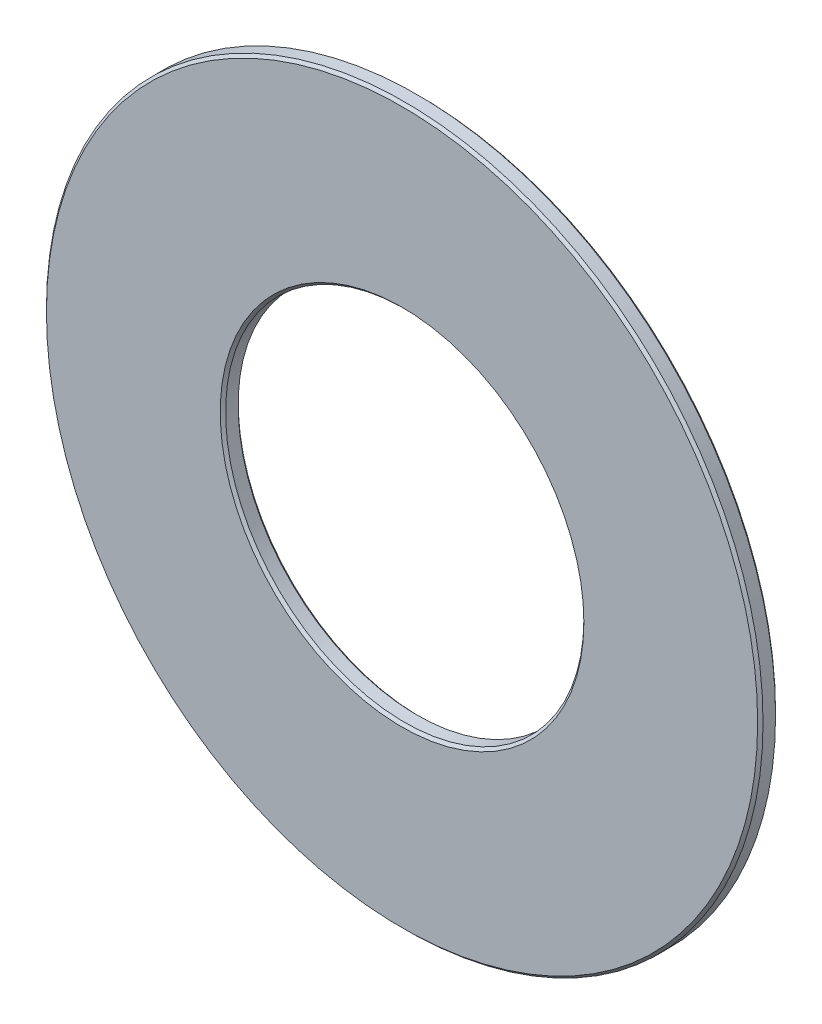
ISO-10303-21;
HEADER;
FILE_DESCRIPTION(('STEP AP214'),'2;1');
FILE_NAME('part.step','',(''),(''),'','','');
FILE_SCHEMA(('AUTOMOTIVE_DESIGN { 1 0 10303 214 1 1 1 1 }'));
ENDSEC;
DATA;
#1=APPLICATION_CONTEXT('core data for automotive mechanical design processes');
#2=APPLICATION_PROTOCOL_DEFINITION('international standard','automotive_design',2000,#1);
#3=PRODUCT_CONTEXT('',#1,'mechanical');
#4=PRODUCT('Part','Part','',(#3));
#5=PRODUCT_RELATED_PRODUCT_CATEGORY('part','',(#4));
#6=PRODUCT_DEFINITION_FORMATION('','',#4);
#7=PRODUCT_DEFINITION_CONTEXT('part definition',#1,'design');
#8=PRODUCT_DEFINITION('design','',#6,#7);
#9=PRODUCT_DEFINITION_SHAPE('','',#8);
#10=(LENGTH_UNIT() NAMED_UNIT(*) SI_UNIT(.MILLI.,.METRE.));
#11=(NAMED_UNIT(*) PLANE_ANGLE_UNIT() SI_UNIT($,.RADIAN.));
#12=(NAMED_UNIT(*) SI_UNIT($,.STERADIAN.) SOLID_ANGLE_UNIT());
#13=UNCERTAINTY_MEASURE_WITH_UNIT(LENGTH_MEASURE(1.E-05),#10,'distance_accuracy_value','');
#14=(GEOMETRIC_REPRESENTATION_CONTEXT(3) GLOBAL_UNCERTAINTY_ASSIGNED_CONTEXT((#13)) GLOBAL_UNIT_ASSIGNED_CONTEXT((#10,
#11,#12)) REPRESENTATION_CONTEXT('',''));
#15=CARTESIAN_POINT('',(0.,0.,0.));
#16=DIRECTION('',(0.,0.,1.));
#17=DIRECTION('',(1.,0.,0.));
#18=AXIS2_PLACEMENT_3D('',#15,#16,#17);
#19=CARTESIAN_POINT('',(0.,0.,0.1));
#20=DIRECTION('',(0.,0.,1.));
#21=DIRECTION('',(1.,0.,0.));
#22=AXIS2_PLACEMENT_3D('',#19,#20,#21);
#23=PLANE('',#22);
#24=CARTESIAN_POINT('',(0.,0.,0.1));
#25=DIRECTION('',(0.,0.,1.));
#26=DIRECTION('',(1.,0.,0.));
#27=AXIS2_PLACEMENT_3D('',#24,#25,#26);
#28=CIRCLE('',#27,2.03);
#29=CARTESIAN_POINT('',(2.03,0.,0.1));
#30=VERTEX_POINT('',#29);
#31=EDGE_CURVE('E56',#30,#30,#28,.F.);
#32=ORIENTED_EDGE('',*,*,#31,.T.);
#33=EDGE_LOOP('',(#32));
#34=FACE_BOUND('',#33,.T.);
#35=CARTESIAN_POINT('',(0.,0.,0.1));
#36=DIRECTION('',(0.,0.,1.));
#37=DIRECTION('',(1.,0.,0.));
#38=AXIS2_PLACEMENT_3D('',#35,#36,#37);
#39=CIRCLE('',#38,3.97);
#40=CARTESIAN_POINT('',(-3.97,0.,0.1));
#41=VERTEX_POINT('',#40);
#42=EDGE_CURVE('E59',#41,#41,#39,.T.);
#43=ORIENTED_EDGE('',*,*,#42,.T.);
#44=EDGE_LOOP('',(#43));
#45=FACE_BOUND('',#44,.T.);
#46=ADVANCED_FACE('F35',(#34,#45),#23,.T.);
#47=CARTESIAN_POINT('',(0.,0.,-0.1));
#48=DIRECTION('',(0.,0.,1.));
#49=DIRECTION('',(1.,0.,0.));
#50=AXIS2_PLACEMENT_3D('',#47,#48,#49);
#51=PLANE('',#50);
#52=CARTESIAN_POINT('',(0.,0.,-0.1));
#53=DIRECTION('',(0.,0.,1.));
#54=DIRECTION('',(1.,0.,0.));
#55=AXIS2_PLACEMENT_3D('',#52,#53,#54);
#56=CIRCLE('',#55,2.03);
#57=CARTESIAN_POINT('',(2.03,0.,-0.1));
#58=VERTEX_POINT('',#57);
#59=EDGE_CURVE('E47',#58,#58,#56,.T.);
#60=ORIENTED_EDGE('',*,*,#59,.T.);
#61=EDGE_LOOP('',(#60));
#62=FACE_BOUND('',#61,.T.);
#63=CARTESIAN_POINT('',(0.,0.,-0.1));
#64=DIRECTION('',(0.,0.,1.));
#65=DIRECTION('',(1.,0.,0.));
#66=AXIS2_PLACEMENT_3D('',#63,#64,#65);
#67=CIRCLE('',#66,3.97);
#68=CARTESIAN_POINT('',(3.97,0.,-0.1));
#69=VERTEX_POINT('',#68);
#70=EDGE_CURVE('E51',#69,#69,#67,.F.);
#71=ORIENTED_EDGE('',*,*,#70,.T.);
#72=EDGE_LOOP('',(#71));
#73=FACE_BOUND('',#72,.T.);
#74=ADVANCED_FACE('F79',(#62,#73),#51,.F.);
#75=CARTESIAN_POINT('',(0.,0.,0.1));
#76=DIRECTION('',(0.,0.,-1.));
#77=DIRECTION('',(-1.,0.,0.));
#78=AXIS2_PLACEMENT_3D('',#75,#76,#77);
#79=CYLINDRICAL_SURFACE('',#78,4.);
#80=CARTESIAN_POINT('',(0.,0.,-0.0700000000000004));
#81=DIRECTION('',(0.,0.,1.));
#82=DIRECTION('',(1.,0.,0.));
#83=AXIS2_PLACEMENT_3D('',#80,#81,#82);
#84=CIRCLE('',#83,4.);
#85=CARTESIAN_POINT('',(4.,0.,-0.0700000000000004));
#86=VERTEX_POINT('',#85);
#87=EDGE_CURVE('E10',#86,#86,#84,.T.);
#88=ORIENTED_EDGE('',*,*,#87,.T.);
#89=EDGE_LOOP('',(#88));
#90=FACE_BOUND('',#89,.T.);
#91=CARTESIAN_POINT('',(0.,0.,0.0700000000000012));
#92=DIRECTION('',(0.,0.,1.));
#93=DIRECTION('',(1.,0.,0.));
#94=AXIS2_PLACEMENT_3D('',#91,#92,#93);
#95=CIRCLE('',#94,4.);
#96=CARTESIAN_POINT('',(-4.,0.,0.0700000000000012));
#97=VERTEX_POINT('',#96);
#98=EDGE_CURVE('E43',#97,#97,#95,.F.);
#99=ORIENTED_EDGE('',*,*,#98,.T.);
#100=EDGE_LOOP('',(#99));
#101=FACE_BOUND('',#100,.T.);
#102=ADVANCED_FACE('F82',(#90,#101),#79,.T.);
#103=CARTESIAN_POINT('',(0.,0.,0.1));
#104=DIRECTION('',(0.,0.,-1.));
#105=DIRECTION('',(-1.,0.,0.));
#106=AXIS2_PLACEMENT_3D('',#103,#104,#105);
#107=CYLINDRICAL_SURFACE('',#106,2.);
#108=CARTESIAN_POINT('',(0.,0.,0.0700000000000008));
#109=DIRECTION('',(0.,0.,1.));
#110=DIRECTION('',(1.,0.,0.));
#111=AXIS2_PLACEMENT_3D('',#108,#109,#110);
#112=CIRCLE('',#111,2.);
#113=CARTESIAN_POINT('',(2.,0.,0.0700000000000008));
#114=VERTEX_POINT('',#113);
#115=EDGE_CURVE('E62',#114,#114,#112,.T.);
#116=ORIENTED_EDGE('',*,*,#115,.T.);
#117=EDGE_LOOP('',(#116));
#118=FACE_BOUND('',#117,.T.);
#119=CARTESIAN_POINT('',(0.,0.,-0.070000000000003));
#120=DIRECTION('',(0.,0.,1.));
#121=DIRECTION('',(1.,0.,0.));
#122=AXIS2_PLACEMENT_3D('',#119,#120,#121);
#123=CIRCLE('',#122,2.);
#124=CARTESIAN_POINT('',(2.,0.,-0.070000000000003));
#125=VERTEX_POINT('',#124);
#126=EDGE_CURVE('E65',#125,#125,#123,.F.);
#127=ORIENTED_EDGE('',*,*,#126,.T.);
#128=EDGE_LOOP('',(#127));
#129=FACE_BOUND('',#128,.T.);
#130=ADVANCED_FACE('F69',(#118,#129),#107,.F.);
#131=CARTESIAN_POINT('',(0.,0.,0.0700000000000008));
#132=DIRECTION('',(0.,0.,1.));
#133=DIRECTION('',(1.,0.,0.));
#134=AXIS2_PLACEMENT_3D('',#131,#132,#133);
#135=CONICAL_SURFACE('',#134,2.,0.785398163397441);
#136=ORIENTED_EDGE('',*,*,#31,.F.);
#137=EDGE_LOOP('',(#136));
#138=FACE_BOUND('',#137,.T.);
#139=ORIENTED_EDGE('',*,*,#115,.F.);
#140=EDGE_LOOP('',(#139));
#141=FACE_BOUND('',#140,.T.);
#142=ADVANCED_FACE('F75',(#138,#141),#135,.F.);
#143=CARTESIAN_POINT('',(0.,0.,-0.1));
#144=DIRECTION('',(0.,0.,-1.));
#145=DIRECTION('',(-1.,0.,0.));
#146=AXIS2_PLACEMENT_3D('',#143,#144,#145);
#147=CONICAL_SURFACE('',#146,2.03,0.785398163397448);
#148=ORIENTED_EDGE('',*,*,#126,.F.);
#149=EDGE_LOOP('',(#148));
#150=FACE_BOUND('',#149,.T.);
#151=ORIENTED_EDGE('',*,*,#59,.F.);
#152=EDGE_LOOP('',(#151));
#153=FACE_BOUND('',#152,.T.);
#154=ADVANCED_FACE('F71',(#150,#153),#147,.F.);
#155=CARTESIAN_POINT('',(0.,0.,-0.0700000000000004));
#156=DIRECTION('',(0.,0.,1.));
#157=DIRECTION('',(1.,0.,0.));
#158=AXIS2_PLACEMENT_3D('',#155,#156,#157);
#159=CONICAL_SURFACE('',#158,4.,0.785398163397434);
#160=ORIENTED_EDGE('',*,*,#70,.F.);
#161=EDGE_LOOP('',(#160));
#162=FACE_BOUND('',#161,.T.);
#163=ORIENTED_EDGE('',*,*,#87,.F.);
#164=EDGE_LOOP('',(#163));
#165=FACE_BOUND('',#164,.T.);
#166=ADVANCED_FACE('F74',(#162,#165),#159,.T.);
#167=CARTESIAN_POINT('',(0.,0.,0.1));
#168=DIRECTION('',(0.,0.,-1.));
#169=DIRECTION('',(-1.,0.,0.));
#170=AXIS2_PLACEMENT_3D('',#167,#168,#169);
#171=CONICAL_SURFACE('',#170,3.97,0.785398163397448);
#172=CARTESIAN_POINT('',(-4.,0.,0.0700000000000012));
#173=CARTESIAN_POINT('',(-3.9996875,0.,0.0703125000000012));
#174=CARTESIAN_POINT('',(-3.999375,0.,0.0706250000000012));
#175=CARTESIAN_POINT('',(-3.99875,0.,0.0712500000000012));
#176=CARTESIAN_POINT('',(-3.9984375,0.,0.0715625000000012));
#177=CARTESIAN_POINT('',(-3.9978125,0.,0.0721875000000011));
#178=CARTESIAN_POINT('',(-3.9975,0.,0.072500000000001));
#179=CARTESIAN_POINT('',(-3.996875,0.,0.0731250000000011));
#180=CARTESIAN_POINT('',(-3.9965625,0.,0.0734375000000011));
#181=CARTESIAN_POINT('',(-3.9959375,0.,0.0740625000000012));
#182=CARTESIAN_POINT('',(-3.995625,0.,0.0743750000000011));
#183=CARTESIAN_POINT('',(-3.995,0.,0.075000000000001));
#184=CARTESIAN_POINT('',(-3.9946875,0.,0.075312500000001));
#185=CARTESIAN_POINT('',(-3.9940625,0.,0.075937500000001));
#186=CARTESIAN_POINT('',(-3.99375,0.,0.076250000000001));
#187=CARTESIAN_POINT('',(-3.993125,0.,0.0768750000000009));
#188=CARTESIAN_POINT('',(-3.9928125,0.,0.0771875000000009));
#189=CARTESIAN_POINT('',(-3.9921875,0.,0.0778125000000009));
#190=CARTESIAN_POINT('',(-3.991875,0.,0.0781250000000009));
#191=CARTESIAN_POINT('',(-3.99125,0.,0.0787500000000009));
#192=CARTESIAN_POINT('',(-3.9909375,0.,0.0790625000000009));
#193=CARTESIAN_POINT('',(-3.9903125,0.,0.0796875000000008));
#194=CARTESIAN_POINT('',(-3.99,0.,0.0800000000000007));
#195=CARTESIAN_POINT('',(-3.989375,0.,0.0806250000000007));
#196=CARTESIAN_POINT('',(-3.9890625,0.,0.0809375000000008));
#197=CARTESIAN_POINT('',(-3.9884375,0.,0.0815625000000009));
#198=CARTESIAN_POINT('',(-3.988125,0.,0.0818750000000008));
#199=CARTESIAN_POINT('',(-3.9875,0.,0.0825000000000007));
#200=CARTESIAN_POINT('',(-3.9871875,0.,0.0828125000000007));
#201=CARTESIAN_POINT('',(-3.9865625,0.,0.0834375000000007));
#202=CARTESIAN_POINT('',(-3.98625,0.,0.0837500000000007));
#203=CARTESIAN_POINT('',(-3.985625,0.,0.0843750000000006));
#204=CARTESIAN_POINT('',(-3.9853125,0.,0.0846875000000006));
#205=CARTESIAN_POINT('',(-3.9846875,0.,0.0853125000000006));
#206=CARTESIAN_POINT('',(-3.984375,0.,0.0856250000000006));
#207=CARTESIAN_POINT('',(-3.98375,0.,0.0862500000000006));
#208=CARTESIAN_POINT('',(-3.9834375,0.,0.0865625000000006));
#209=CARTESIAN_POINT('',(-3.9828125,0.,0.0871875000000005));
#210=CARTESIAN_POINT('',(-3.9825,0.,0.0875000000000004));
#211=CARTESIAN_POINT('',(-3.981875,0.,0.0881250000000004));
#212=CARTESIAN_POINT('',(-3.9815625,0.,0.0884375000000005));
#213=CARTESIAN_POINT('',(-3.9809375,0.,0.0890625000000005));
#214=CARTESIAN_POINT('',(-3.980625,0.,0.0893750000000005));
#215=CARTESIAN_POINT('',(-3.98,0.,0.0900000000000004));
#216=CARTESIAN_POINT('',(-3.9796875,0.,0.0903125000000004));
#217=CARTESIAN_POINT('',(-3.9790625,0.,0.0909375000000004));
#218=CARTESIAN_POINT('',(-3.97875,0.,0.0912500000000004));
#219=CARTESIAN_POINT('',(-3.978125,0.,0.0918750000000003));
#220=CARTESIAN_POINT('',(-3.9778125,0.,0.0921875000000003));
#221=CARTESIAN_POINT('',(-3.9771875,0.,0.0928125000000003));
#222=CARTESIAN_POINT('',(-3.976875,0.,0.0931250000000003));
#223=CARTESIAN_POINT('',(-3.97625,0.,0.0937500000000003));
#224=CARTESIAN_POINT('',(-3.9759375,0.,0.0940625000000003));
#225=CARTESIAN_POINT('',(-3.9753125,0.,0.0946875000000002));
#226=CARTESIAN_POINT('',(-3.975,0.,0.0950000000000001));
#227=CARTESIAN_POINT('',(-3.974375,0.,0.0956250000000001));
#228=CARTESIAN_POINT('',(-3.9740625,0.,0.0959375000000002));
#229=CARTESIAN_POINT('',(-3.9734375,0.,0.0965625000000002));
#230=CARTESIAN_POINT('',(-3.973125,0.,0.0968750000000002));
#231=CARTESIAN_POINT('',(-3.9725,0.,0.0975000000000001));
#232=CARTESIAN_POINT('',(-3.9721875,0.,0.0978125000000001));
#233=CARTESIAN_POINT('',(-3.9715625,0.,0.0984375000000001));
#234=CARTESIAN_POINT('',(-3.97125,0.,0.0987500000000001));
#235=CARTESIAN_POINT('',(-3.970625,0.,0.099375));
#236=CARTESIAN_POINT('',(-3.9703125,0.,0.0996875));
#237=CARTESIAN_POINT('',(-3.97,0.,0.1));
#238=B_SPLINE_CURVE_WITH_KNOTS('',3,(#172,#173,#174,#175,#176,#177,#178,#179,#180,#181,#182,
#183,#184,#185,#186,#187,#188,#189,#190,#191,#192,#193,#194,#195,#196,#197,#198,#199,#200,#201,
#202,#203,#204,#205,#206,#207,#208,#209,#210,#211,#212,#213,#214,#215,#216,#217,#218,#219,#220,
#221,#222,#223,#224,#225,#226,#227,#228,#229,#230,#231,#232,#233,#234,#235,#236,#237),
.UNSPECIFIED.,.F.,.F.,(4,2,2,2,2,2,2,2,2,2,2,2,2,2,2,2,2,2,2,2,2,2,2,2,2,2,2,2,2,2,2,2,4),(0.,
0.0013258252147248,0.0026516504294496,0.0039774756441744,0.00530330085889858,
0.00662912607362338,0.00795495128834818,0.00928077650307298,0.0106066017177978,
0.0119324269325226,0.0132582521472474,0.0145840773619722,0.0159099025766964,0.0172357277914212,
0.018561553006146,0.0198873782208708,0.0212132034355956,0.0225390286503204,0.0238648538650452,
0.02519067907977,0.0265165042944941,0.0278423295092189,0.0291681547239437,0.0304939799386685,
0.0318198051533933,0.0331456303681181,0.0344714555828429,0.0357972807975677,0.0371231060122919,
0.0384489312270167,0.0397747564417415,0.0411005816564663,0.0424264068711911),.UNSPECIFIED.);
#239=EDGE_CURVE('BSEAM38',#97,#41,#238,.T.);
#240=ORIENTED_EDGE('',*,*,#98,.F.);
#241=ORIENTED_EDGE('',*,*,#42,.F.);
#242=ORIENTED_EDGE('',*,*,#239,.T.);
#243=ORIENTED_EDGE('',*,*,#239,.F.);
#244=EDGE_LOOP('',(#240,#242,#241,#243));
#245=FACE_BOUND('',#244,.T.);
#246=ADVANCED_FACE('F38',(#245),#171,.T.);
#247=CLOSED_SHELL('',(#46,#74,#102,#130,#142,#154,#166,#246));
#248=MANIFOLD_SOLID_BREP('B2',#247);
#249=ADVANCED_BREP_SHAPE_REPRESENTATION('',(#18,#248),#14);
#250=SHAPE_DEFINITION_REPRESENTATION(#9,#249);
ENDSEC;
END-ISO-10303-21;
